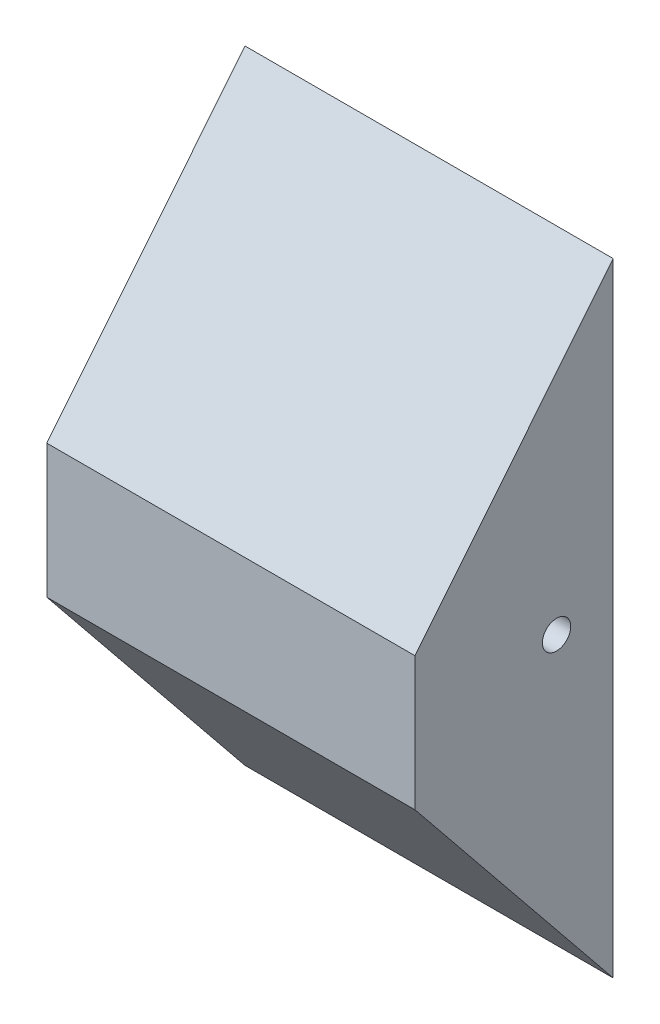
ISO-10303-21;
HEADER;
FILE_DESCRIPTION(('STEP AP214'),'2;1');
FILE_NAME('part.step','',(''),(''),'','','');
FILE_SCHEMA(('AUTOMOTIVE_DESIGN { 1 0 10303 214 1 1 1 1 }'));
ENDSEC;
DATA;
#1=APPLICATION_CONTEXT('core data for automotive mechanical design processes');
#2=APPLICATION_PROTOCOL_DEFINITION('international standard','automotive_design',2000,#1);
#3=PRODUCT_CONTEXT('',#1,'mechanical');
#4=PRODUCT('Part','Part','',(#3));
#5=PRODUCT_RELATED_PRODUCT_CATEGORY('part','',(#4));
#6=PRODUCT_DEFINITION_FORMATION('','',#4);
#7=PRODUCT_DEFINITION_CONTEXT('part definition',#1,'design');
#8=PRODUCT_DEFINITION('design','',#6,#7);
#9=PRODUCT_DEFINITION_SHAPE('','',#8);
#10=(LENGTH_UNIT() NAMED_UNIT(*) SI_UNIT(.MILLI.,.METRE.));
#11=(NAMED_UNIT(*) PLANE_ANGLE_UNIT() SI_UNIT($,.RADIAN.));
#12=(NAMED_UNIT(*) SI_UNIT($,.STERADIAN.) SOLID_ANGLE_UNIT());
#13=UNCERTAINTY_MEASURE_WITH_UNIT(LENGTH_MEASURE(1.E-05),#10,'distance_accuracy_value','');
#14=(GEOMETRIC_REPRESENTATION_CONTEXT(3) GLOBAL_UNCERTAINTY_ASSIGNED_CONTEXT((#13)) GLOBAL_UNIT_ASSIGNED_CONTEXT((#10,
#11,#12)) REPRESENTATION_CONTEXT('',''));
#15=CARTESIAN_POINT('',(0.,0.,0.));
#16=DIRECTION('',(0.,0.,1.));
#17=DIRECTION('',(1.,0.,0.));
#18=AXIS2_PLACEMENT_3D('',#15,#16,#17);
#19=CARTESIAN_POINT('',(6.5,11.,7.));
#20=DIRECTION('',(-1.,0.,0.));
#21=DIRECTION('',(0.,-1.,0.));
#22=AXIS2_PLACEMENT_3D('',#19,#20,#21);
#23=PLANE('',#22);
#24=CARTESIAN_POINT('',(6.5,0.499999999999998,2.));
#25=DIRECTION('',(1.,0.,0.));
#26=DIRECTION('',(0.,1.,0.));
#27=AXIS2_PLACEMENT_3D('',#24,#25,#26);
#28=CIRCLE('',#27,0.5);
#29=CARTESIAN_POINT('',(6.5,0.999999999999998,2.));
#30=VERTEX_POINT('',#29);
#31=EDGE_CURVE('E233',#30,#30,#28,.T.);
#32=ORIENTED_EDGE('',*,*,#31,.F.);
#33=EDGE_LOOP('',(#32));
#34=FACE_BOUND('',#33,.T.);
#35=DIRECTION('',(0.,-0.777145961456968,0.629320391049841));
#36=VECTOR('',#35,1.);
#37=CARTESIAN_POINT('',(6.5,4.35648570050238,5.37981180403594));
#38=LINE('',#37,#36);
#39=CARTESIAN_POINT('',(6.5,11.,0.));
#40=VERTEX_POINT('',#39);
#41=CARTESIAN_POINT('',(6.5,2.35571990425473,7.));
#42=VERTEX_POINT('',#41);
#43=EDGE_CURVE('E160',#40,#42,#38,.T.);
#44=ORIENTED_EDGE('',*,*,#43,.T.);
#45=DIRECTION('',(0.,1.,0.));
#46=VECTOR('',#45,1.);
#47=CARTESIAN_POINT('',(6.5,11.,7.));
#48=LINE('',#47,#46);
#49=CARTESIAN_POINT('',(6.5,-2.35571990425474,7.));
#50=VERTEX_POINT('',#49);
#51=EDGE_CURVE('E177',#50,#42,#48,.T.);
#52=ORIENTED_EDGE('',*,*,#51,.F.);
#53=DIRECTION('',(0.,0.777145961456967,0.629320391049842));
#54=VECTOR('',#53,1.);
#55=CARTESIAN_POINT('',(6.5,-4.35648570050239,5.37981180403595));
#56=LINE('',#55,#54);
#57=CARTESIAN_POINT('',(6.5,-11.,0.));
#58=VERTEX_POINT('',#57);
#59=EDGE_CURVE('E113',#58,#50,#56,.T.);
#60=ORIENTED_EDGE('',*,*,#59,.F.);
#61=DIRECTION('',(0.,1.,0.));
#62=VECTOR('',#61,1.);
#63=CARTESIAN_POINT('',(6.5,11.,0.));
#64=LINE('',#63,#62);
#65=EDGE_CURVE('E167',#58,#40,#64,.T.);
#66=ORIENTED_EDGE('',*,*,#65,.T.);
#67=EDGE_LOOP('',(#44,#52,#60,#66));
#68=FACE_BOUND('',#67,.T.);
#69=ADVANCED_FACE('F40',(#34,#68),#23,.F.);
#70=CARTESIAN_POINT('',(-6.5,11.,7.));
#71=DIRECTION('',(1.,0.,0.));
#72=DIRECTION('',(0.,1.,0.));
#73=AXIS2_PLACEMENT_3D('',#70,#71,#72);
#74=PLANE('',#73);
#75=CARTESIAN_POINT('',(-6.50000000000001,0.499999999999996,2.));
#76=DIRECTION('',(1.,0.,0.));
#77=DIRECTION('',(0.,1.,0.));
#78=AXIS2_PLACEMENT_3D('',#75,#76,#77);
#79=CIRCLE('',#78,0.5);
#80=CARTESIAN_POINT('',(-6.50000000000001,0.999999999999996,2.));
#81=VERTEX_POINT('',#80);
#82=EDGE_CURVE('E236',#81,#81,#79,.T.);
#83=ORIENTED_EDGE('',*,*,#82,.T.);
#84=EDGE_LOOP('',(#83));
#85=FACE_BOUND('',#84,.T.);
#86=DIRECTION('',(0.,-0.777145961456968,0.629320391049841));
#87=VECTOR('',#86,1.);
#88=CARTESIAN_POINT('',(-6.5,4.35648570050238,5.37981180403594));
#89=LINE('',#88,#87);
#90=CARTESIAN_POINT('',(-6.50000000000001,11.,0.));
#91=VERTEX_POINT('',#90);
#92=CARTESIAN_POINT('',(-6.5,2.35571990425472,7.));
#93=VERTEX_POINT('',#92);
#94=EDGE_CURVE('E156',#91,#93,#89,.T.);
#95=ORIENTED_EDGE('',*,*,#94,.F.);
#96=DIRECTION('',(0.,-1.,0.));
#97=VECTOR('',#96,1.);
#98=CARTESIAN_POINT('',(-6.5,11.,0.));
#99=LINE('',#98,#97);
#100=CARTESIAN_POINT('',(-6.5,-11.,0.));
#101=VERTEX_POINT('',#100);
#102=EDGE_CURVE('E191',#91,#101,#99,.T.);
#103=ORIENTED_EDGE('',*,*,#102,.T.);
#104=DIRECTION('',(0.,0.777145961456967,0.629320391049842));
#105=VECTOR('',#104,1.);
#106=CARTESIAN_POINT('',(-6.5,-4.35648570050239,5.37981180403595));
#107=LINE('',#106,#105);
#108=CARTESIAN_POINT('',(-6.5,-2.35571990425475,7.));
#109=VERTEX_POINT('',#108);
#110=EDGE_CURVE('E168',#101,#109,#107,.T.);
#111=ORIENTED_EDGE('',*,*,#110,.T.);
#112=DIRECTION('',(0.,-1.,0.));
#113=VECTOR('',#112,1.);
#114=CARTESIAN_POINT('',(-6.5,11.,7.));
#115=LINE('',#114,#113);
#116=EDGE_CURVE('E48',#93,#109,#115,.T.);
#117=ORIENTED_EDGE('',*,*,#116,.F.);
#118=EDGE_LOOP('',(#95,#103,#111,#117));
#119=FACE_BOUND('',#118,.T.);
#120=ADVANCED_FACE('F212',(#85,#119),#74,.F.);
#121=CARTESIAN_POINT('',(0.,0.,7.));
#122=DIRECTION('',(0.,0.,1.));
#123=DIRECTION('',(1.,0.,0.));
#124=AXIS2_PLACEMENT_3D('',#121,#122,#123);
#125=PLANE('',#124);
#126=ORIENTED_EDGE('',*,*,#51,.T.);
#127=DIRECTION('',(1.,0.,0.));
#128=VECTOR('',#127,1.);
#129=CARTESIAN_POINT('',(-6.5,2.35571990425472,7.));
#130=LINE('',#129,#128);
#131=EDGE_CURVE('E159',#93,#42,#130,.T.);
#132=ORIENTED_EDGE('',*,*,#131,.F.);
#133=ORIENTED_EDGE('',*,*,#116,.T.);
#134=DIRECTION('',(1.,0.,0.));
#135=VECTOR('',#134,1.);
#136=CARTESIAN_POINT('',(-6.5,-2.35571990425475,7.));
#137=LINE('',#136,#135);
#138=EDGE_CURVE('E164',#109,#50,#137,.T.);
#139=ORIENTED_EDGE('',*,*,#138,.T.);
#140=EDGE_LOOP('',(#126,#132,#133,#139));
#141=FACE_BOUND('',#140,.T.);
#142=ADVANCED_FACE('F214',(#141),#125,.T.);
#143=CARTESIAN_POINT('',(0.,0.,0.));
#144=DIRECTION('',(0.,0.,1.));
#145=DIRECTION('',(1.,0.,0.));
#146=AXIS2_PLACEMENT_3D('',#143,#144,#145);
#147=PLANE('',#146);
#148=CARTESIAN_POINT('',(0.,-6.,0.));
#149=DIRECTION('',(0.,0.,1.));
#150=DIRECTION('',(1.,0.,0.));
#151=AXIS2_PLACEMENT_3D('',#148,#149,#150);
#152=CIRCLE('',#151,2.27104727170848);
#153=CARTESIAN_POINT('',(2.27104727170848,-6.,0.));
#154=VERTEX_POINT('',#153);
#155=EDGE_CURVE('E11',#154,#154,#152,.F.);
#156=ORIENTED_EDGE('',*,*,#155,.F.);
#157=EDGE_LOOP('',(#156));
#158=FACE_BOUND('',#157,.T.);
#159=DIRECTION('',(-1.,0.,0.));
#160=VECTOR('',#159,1.);
#161=CARTESIAN_POINT('',(0.,8.45139065929624,0.));
#162=LINE('',#161,#160);
#163=CARTESIAN_POINT('',(0.291832221344793,8.45139065929624,0.));
#164=VERTEX_POINT('',#163);
#165=CARTESIAN_POINT('',(-0.291832221344792,8.45139065929624,0.));
#166=VERTEX_POINT('',#165);
#167=EDGE_CURVE('E55',#164,#166,#162,.T.);
#168=ORIENTED_EDGE('',*,*,#167,.T.);
#169=DIRECTION('',(0.,-1.,0.));
#170=VECTOR('',#169,1.);
#171=CARTESIAN_POINT('',(-0.291832221344793,0.,0.));
#172=LINE('',#171,#170);
#173=CARTESIAN_POINT('',(-0.291832221344793,3.54860934070375,0.));
#174=VERTEX_POINT('',#173);
#175=EDGE_CURVE('E109',#166,#174,#172,.T.);
#176=ORIENTED_EDGE('',*,*,#175,.T.);
#177=DIRECTION('',(-1.,0.,0.));
#178=VECTOR('',#177,1.);
#179=CARTESIAN_POINT('',(0.,3.54860934070375,0.));
#180=LINE('',#179,#178);
#181=CARTESIAN_POINT('',(0.291832221344792,3.54860934070375,0.));
#182=VERTEX_POINT('',#181);
#183=EDGE_CURVE('E124',#182,#174,#180,.T.);
#184=ORIENTED_EDGE('',*,*,#183,.F.);
#185=DIRECTION('',(0.,-1.,0.));
#186=VECTOR('',#185,1.);
#187=CARTESIAN_POINT('',(0.291832221344792,0.,0.));
#188=LINE('',#187,#186);
#189=EDGE_CURVE('E60',#164,#182,#188,.T.);
#190=ORIENTED_EDGE('',*,*,#189,.F.);
#191=EDGE_LOOP('',(#168,#176,#184,#190));
#192=FACE_BOUND('',#191,.T.);
#193=ORIENTED_EDGE('',*,*,#65,.F.);
#194=DIRECTION('',(1.,0.,0.));
#195=VECTOR('',#194,1.);
#196=CARTESIAN_POINT('',(-6.5,-11.,0.));
#197=LINE('',#196,#195);
#198=EDGE_CURVE('E181',#101,#58,#197,.T.);
#199=ORIENTED_EDGE('',*,*,#198,.F.);
#200=ORIENTED_EDGE('',*,*,#102,.F.);
#201=DIRECTION('',(-1.,0.,0.));
#202=VECTOR('',#201,1.);
#203=CARTESIAN_POINT('',(-6.5,11.,0.));
#204=LINE('',#203,#202);
#205=EDGE_CURVE('E188',#40,#91,#204,.T.);
#206=ORIENTED_EDGE('',*,*,#205,.F.);
#207=EDGE_LOOP('',(#193,#199,#200,#206));
#208=FACE_BOUND('',#207,.T.);
#209=ADVANCED_FACE('F205',(#158,#192,#208),#147,.F.);
#210=CARTESIAN_POINT('',(-6.5,-4.35648570050239,5.37981180403595));
#211=DIRECTION('',(0.,0.629320391049842,-0.777145961456967));
#212=DIRECTION('',(0.,0.777145961456967,0.629320391049842));
#213=AXIS2_PLACEMENT_3D('',#210,#211,#212);
#214=PLANE('',#213);
#215=ORIENTED_EDGE('',*,*,#59,.T.);
#216=ORIENTED_EDGE('',*,*,#138,.F.);
#217=ORIENTED_EDGE('',*,*,#110,.F.);
#218=ORIENTED_EDGE('',*,*,#198,.T.);
#219=EDGE_LOOP('',(#215,#216,#217,#218));
#220=FACE_BOUND('',#219,.T.);
#221=ADVANCED_FACE('F198',(#220),#214,.F.);
#222=CARTESIAN_POINT('',(-6.5,4.35648570050238,5.37981180403594));
#223=DIRECTION('',(0.,0.629320391049841,0.777145961456968));
#224=DIRECTION('',(0.,-0.777145961456968,0.629320391049841));
#225=AXIS2_PLACEMENT_3D('',#222,#223,#224);
#226=PLANE('',#225);
#227=ORIENTED_EDGE('',*,*,#43,.F.);
#228=ORIENTED_EDGE('',*,*,#205,.T.);
#229=ORIENTED_EDGE('',*,*,#94,.T.);
#230=ORIENTED_EDGE('',*,*,#131,.T.);
#231=EDGE_LOOP('',(#227,#228,#229,#230));
#232=FACE_BOUND('',#231,.T.);
#233=ADVANCED_FACE('F208',(#232),#226,.T.);
#234=CARTESIAN_POINT('',(-0.291832221344793,0.,-0.5));
#235=DIRECTION('',(-1.,0.,0.));
#236=DIRECTION('',(0.,-1.,0.));
#237=AXIS2_PLACEMENT_3D('',#234,#235,#236);
#238=PLANE('',#237);
#239=ORIENTED_EDGE('',*,*,#175,.F.);
#240=DIRECTION('',(0.,0.,1.));
#241=VECTOR('',#240,1.);
#242=CARTESIAN_POINT('',(-0.291832221344792,8.45139065929624,-0.5));
#243=LINE('',#242,#241);
#244=CARTESIAN_POINT('',(-0.291832221344792,8.45139065929624,-0.5));
#245=VERTEX_POINT('',#244);
#246=EDGE_CURVE('E104',#245,#166,#243,.T.);
#247=ORIENTED_EDGE('',*,*,#246,.F.);
#248=DIRECTION('',(0.,-1.,0.));
#249=VECTOR('',#248,1.);
#250=CARTESIAN_POINT('',(-0.291832221344793,0.,-0.5));
#251=LINE('',#250,#249);
#252=CARTESIAN_POINT('',(-0.291832221344793,3.54860934070375,-0.5));
#253=VERTEX_POINT('',#252);
#254=EDGE_CURVE('E108',#245,#253,#251,.T.);
#255=ORIENTED_EDGE('',*,*,#254,.T.);
#256=DIRECTION('',(0.,0.,1.));
#257=VECTOR('',#256,1.);
#258=CARTESIAN_POINT('',(-0.291832221344793,3.54860934070375,-0.5));
#259=LINE('',#258,#257);
#260=EDGE_CURVE('E137',#253,#174,#259,.T.);
#261=ORIENTED_EDGE('',*,*,#260,.T.);
#262=EDGE_LOOP('',(#239,#247,#255,#261));
#263=FACE_BOUND('',#262,.T.);
#264=ADVANCED_FACE('F106',(#263),#238,.T.);
#265=CARTESIAN_POINT('',(0.,8.45139065929624,-0.5));
#266=DIRECTION('',(0.,1.,0.));
#267=DIRECTION('',(0.,0.,1.));
#268=AXIS2_PLACEMENT_3D('',#265,#266,#267);
#269=PLANE('',#268);
#270=ORIENTED_EDGE('',*,*,#167,.F.);
#271=DIRECTION('',(0.,0.,1.));
#272=VECTOR('',#271,1.);
#273=CARTESIAN_POINT('',(0.291832221344793,8.45139065929624,-0.5));
#274=LINE('',#273,#272);
#275=CARTESIAN_POINT('',(0.291832221344793,8.45139065929624,-0.5));
#276=VERTEX_POINT('',#275);
#277=EDGE_CURVE('E114',#276,#164,#274,.T.);
#278=ORIENTED_EDGE('',*,*,#277,.F.);
#279=DIRECTION('',(-1.,0.,0.));
#280=VECTOR('',#279,1.);
#281=CARTESIAN_POINT('',(0.,8.45139065929624,-0.5));
#282=LINE('',#281,#280);
#283=EDGE_CURVE('E119',#276,#245,#282,.T.);
#284=ORIENTED_EDGE('',*,*,#283,.T.);
#285=ORIENTED_EDGE('',*,*,#246,.T.);
#286=EDGE_LOOP('',(#270,#278,#284,#285));
#287=FACE_BOUND('',#286,.T.);
#288=ADVANCED_FACE('F126',(#287),#269,.T.);
#289=CARTESIAN_POINT('',(0.291832221344792,0.,-0.5));
#290=DIRECTION('',(-1.,0.,0.));
#291=DIRECTION('',(0.,-1.,0.));
#292=AXIS2_PLACEMENT_3D('',#289,#290,#291);
#293=PLANE('',#292);
#294=ORIENTED_EDGE('',*,*,#189,.T.);
#295=DIRECTION('',(0.,0.,1.));
#296=VECTOR('',#295,1.);
#297=CARTESIAN_POINT('',(0.291832221344792,3.54860934070375,-0.5));
#298=LINE('',#297,#296);
#299=CARTESIAN_POINT('',(0.291832221344792,3.54860934070375,-0.5));
#300=VERTEX_POINT('',#299);
#301=EDGE_CURVE('E150',#300,#182,#298,.T.);
#302=ORIENTED_EDGE('',*,*,#301,.F.);
#303=DIRECTION('',(0.,-1.,0.));
#304=VECTOR('',#303,1.);
#305=CARTESIAN_POINT('',(0.291832221344792,0.,-0.5));
#306=LINE('',#305,#304);
#307=EDGE_CURVE('E129',#276,#300,#306,.T.);
#308=ORIENTED_EDGE('',*,*,#307,.F.);
#309=ORIENTED_EDGE('',*,*,#277,.T.);
#310=EDGE_LOOP('',(#294,#302,#308,#309));
#311=FACE_BOUND('',#310,.T.);
#312=ADVANCED_FACE('F273',(#311),#293,.F.);
#313=CARTESIAN_POINT('',(0.,3.54860934070375,-0.5));
#314=DIRECTION('',(0.,1.,0.));
#315=DIRECTION('',(0.,0.,1.));
#316=AXIS2_PLACEMENT_3D('',#313,#314,#315);
#317=PLANE('',#316);
#318=ORIENTED_EDGE('',*,*,#183,.T.);
#319=ORIENTED_EDGE('',*,*,#260,.F.);
#320=DIRECTION('',(-1.,0.,0.));
#321=VECTOR('',#320,1.);
#322=CARTESIAN_POINT('',(0.,3.54860934070375,-0.5));
#323=LINE('',#322,#321);
#324=EDGE_CURVE('E121',#300,#253,#323,.T.);
#325=ORIENTED_EDGE('',*,*,#324,.F.);
#326=ORIENTED_EDGE('',*,*,#301,.T.);
#327=EDGE_LOOP('',(#318,#319,#325,#326));
#328=FACE_BOUND('',#327,.T.);
#329=ADVANCED_FACE('F267',(#328),#317,.F.);
#330=CARTESIAN_POINT('',(0.,0.,-0.5));
#331=DIRECTION('',(0.,0.,-1.));
#332=DIRECTION('',(-1.,0.,0.));
#333=AXIS2_PLACEMENT_3D('',#330,#331,#332);
#334=PLANE('',#333);
#335=ORIENTED_EDGE('',*,*,#254,.F.);
#336=ORIENTED_EDGE('',*,*,#283,.F.);
#337=ORIENTED_EDGE('',*,*,#307,.T.);
#338=ORIENTED_EDGE('',*,*,#324,.T.);
#339=EDGE_LOOP('',(#335,#336,#337,#338));
#340=FACE_BOUND('',#339,.T.);
#341=ADVANCED_FACE('F118',(#340),#334,.T.);
#342=CARTESIAN_POINT('',(0.,-6.,-0.5));
#343=DIRECTION('',(0.,0.,1.));
#344=DIRECTION('',(1.,0.,0.));
#345=AXIS2_PLACEMENT_3D('',#342,#343,#344);
#346=CYLINDRICAL_SURFACE('',#345,2.27104727170848);
#347=CARTESIAN_POINT('',(0.,-6.,-0.5));
#348=DIRECTION('',(0.,0.,-1.));
#349=DIRECTION('',(-1.,0.,0.));
#350=AXIS2_PLACEMENT_3D('',#347,#348,#349);
#351=CIRCLE('',#350,2.27104727170848);
#352=CARTESIAN_POINT('',(-2.27104727170848,-6.,-0.5));
#353=VERTEX_POINT('',#352);
#354=EDGE_CURVE('E140',#353,#353,#351,.T.);
#355=ORIENTED_EDGE('',*,*,#354,.F.);
#356=EDGE_LOOP('',(#355));
#357=FACE_BOUND('',#356,.T.);
#358=ORIENTED_EDGE('',*,*,#155,.T.);
#359=EDGE_LOOP('',(#358));
#360=FACE_BOUND('',#359,.T.);
#361=ADVANCED_FACE('F255',(#357,#360),#346,.T.);
#362=CARTESIAN_POINT('',(0.,0.,-0.5));
#363=DIRECTION('',(0.,0.,-1.));
#364=DIRECTION('',(-1.,0.,0.));
#365=AXIS2_PLACEMENT_3D('',#362,#363,#364);
#366=PLANE('',#365);
#367=CARTESIAN_POINT('',(0.,-6.,-0.5));
#368=DIRECTION('',(0.,0.,-1.));
#369=DIRECTION('',(-1.,0.,0.));
#370=AXIS2_PLACEMENT_3D('',#367,#368,#369);
#371=CIRCLE('',#370,1.92393732191146);
#372=CARTESIAN_POINT('',(-1.92393732191146,-6.,-0.5));
#373=VERTEX_POINT('',#372);
#374=EDGE_CURVE('E240',#373,#373,#371,.T.);
#375=ORIENTED_EDGE('',*,*,#374,.F.);
#376=EDGE_LOOP('',(#375));
#377=FACE_BOUND('',#376,.T.);
#378=ORIENTED_EDGE('',*,*,#354,.T.);
#379=EDGE_LOOP('',(#378));
#380=FACE_BOUND('',#379,.T.);
#381=ADVANCED_FACE('F253',(#377,#380),#366,.T.);
#382=CARTESIAN_POINT('',(0.,-6.,0.));
#383=DIRECTION('',(0.,0.,-1.));
#384=DIRECTION('',(-1.,0.,0.));
#385=AXIS2_PLACEMENT_3D('',#382,#383,#384);
#386=CYLINDRICAL_SURFACE('',#385,1.92393732191146);
#387=CARTESIAN_POINT('',(0.,-6.,0.));
#388=DIRECTION('',(0.,0.,-1.));
#389=DIRECTION('',(-1.,0.,0.));
#390=AXIS2_PLACEMENT_3D('',#387,#388,#389);
#391=CIRCLE('',#390,1.92393732191146);
#392=CARTESIAN_POINT('',(-1.92393732191146,-6.,0.));
#393=VERTEX_POINT('',#392);
#394=EDGE_CURVE('E243',#393,#393,#391,.T.);
#395=ORIENTED_EDGE('',*,*,#394,.F.);
#396=EDGE_LOOP('',(#395));
#397=FACE_BOUND('',#396,.T.);
#398=ORIENTED_EDGE('',*,*,#374,.T.);
#399=EDGE_LOOP('',(#398));
#400=FACE_BOUND('',#399,.T.);
#401=ADVANCED_FACE('F264',(#397,#400),#386,.F.);
#402=CARTESIAN_POINT('',(0.,-6.,0.));
#403=DIRECTION('',(0.,0.,-1.));
#404=DIRECTION('',(-1.,0.,0.));
#405=AXIS2_PLACEMENT_3D('',#402,#403,#404);
#406=PLANE('',#405);
#407=ORIENTED_EDGE('',*,*,#394,.T.);
#408=EDGE_LOOP('',(#407));
#409=FACE_BOUND('',#408,.T.);
#410=ADVANCED_FACE('F330',(#409),#406,.T.);
#411=CARTESIAN_POINT('',(-6.50000000000001,0.499999999999996,2.));
#412=DIRECTION('',(1.,0.,0.));
#413=DIRECTION('',(0.,1.,0.));
#414=AXIS2_PLACEMENT_3D('',#411,#412,#413);
#415=CYLINDRICAL_SURFACE('',#414,0.5);
#416=ORIENTED_EDGE('',*,*,#82,.F.);
#417=EDGE_LOOP('',(#416));
#418=FACE_BOUND('',#417,.T.);
#419=ORIENTED_EDGE('',*,*,#31,.T.);
#420=EDGE_LOOP('',(#419));
#421=FACE_BOUND('',#420,.T.);
#422=ADVANCED_FACE('F338',(#418,#421),#415,.F.);
#423=CLOSED_SHELL('',(#69,#120,#142,#209,#221,#233,#264,#288,#312,#329,#341,#361,#381,#401,#410,#422));
#424=MANIFOLD_SOLID_BREP('B2',#423);
#425=ADVANCED_BREP_SHAPE_REPRESENTATION('',(#18,#424),#14);
#426=SHAPE_DEFINITION_REPRESENTATION(#9,#425);
ENDSEC;
END-ISO-10303-21;
